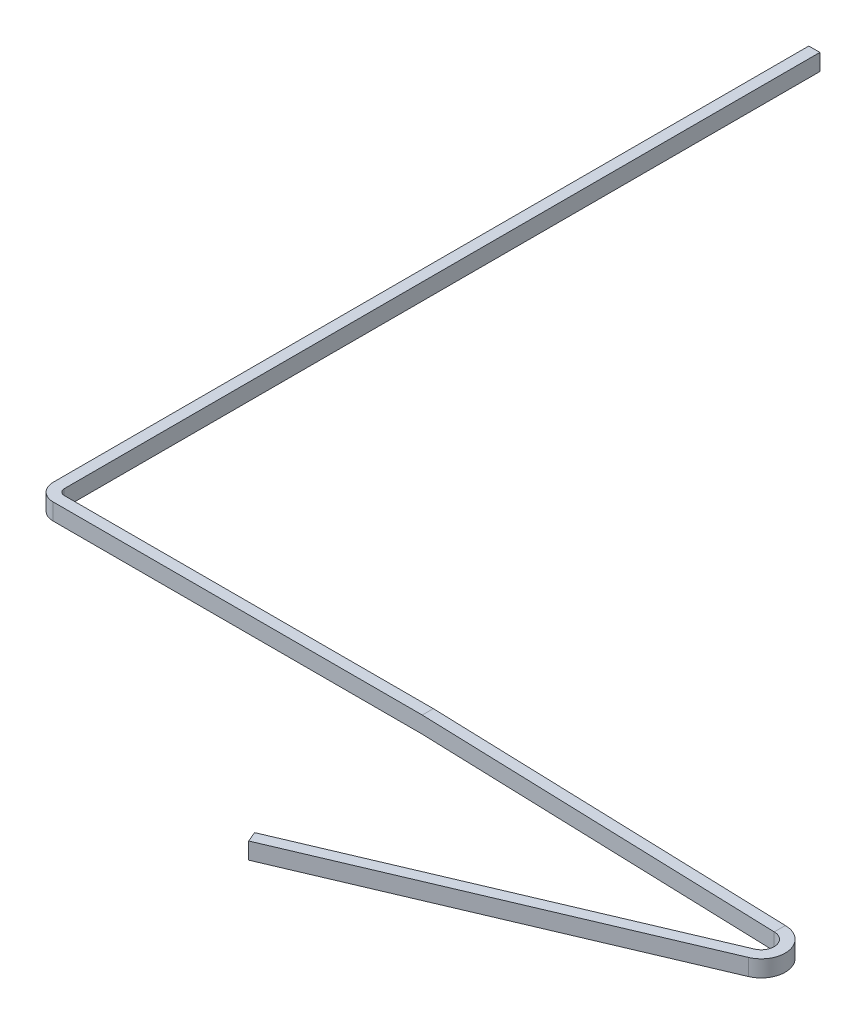
ISO-10303-21;
HEADER;
FILE_DESCRIPTION(('STEP AP214'),'2;1');
FILE_NAME('part.step','',(''),(''),'','','');
FILE_SCHEMA(('AUTOMOTIVE_DESIGN { 1 0 10303 214 1 1 1 1 }'));
ENDSEC;
DATA;
#1=APPLICATION_CONTEXT('core data for automotive mechanical design processes');
#2=APPLICATION_PROTOCOL_DEFINITION('international standard','automotive_design',2000,#1);
#3=PRODUCT_CONTEXT('',#1,'mechanical');
#4=PRODUCT('Part','Part','',(#3));
#5=PRODUCT_RELATED_PRODUCT_CATEGORY('part','',(#4));
#6=PRODUCT_DEFINITION_FORMATION('','',#4);
#7=PRODUCT_DEFINITION_CONTEXT('part definition',#1,'design');
#8=PRODUCT_DEFINITION('design','',#6,#7);
#9=PRODUCT_DEFINITION_SHAPE('','',#8);
#10=(LENGTH_UNIT() NAMED_UNIT(*) SI_UNIT(.MILLI.,.METRE.));
#11=(NAMED_UNIT(*) PLANE_ANGLE_UNIT() SI_UNIT($,.RADIAN.));
#12=(NAMED_UNIT(*) SI_UNIT($,.STERADIAN.) SOLID_ANGLE_UNIT());
#13=UNCERTAINTY_MEASURE_WITH_UNIT(LENGTH_MEASURE(1.E-05),#10,'distance_accuracy_value','');
#14=(GEOMETRIC_REPRESENTATION_CONTEXT(3) GLOBAL_UNCERTAINTY_ASSIGNED_CONTEXT((#13)) GLOBAL_UNIT_ASSIGNED_CONTEXT((#10,
#11,#12)) REPRESENTATION_CONTEXT('',''));
#15=CARTESIAN_POINT('',(0.,0.,0.));
#16=DIRECTION('',(0.,0.,1.));
#17=DIRECTION('',(1.,0.,0.));
#18=AXIS2_PLACEMENT_3D('',#15,#16,#17);
#19=CARTESIAN_POINT('',(0.31,0.225,20.94));
#20=DIRECTION('',(0.,0.,1.));
#21=DIRECTION('',(0.,-1.,0.));
#22=AXIS2_PLACEMENT_3D('',#19,#20,#21);
#23=PLANE('',#22);
#24=DIRECTION('',(1.,0.,0.));
#25=VECTOR('',#24,1.);
#26=CARTESIAN_POINT('',(5.08188626202887,0.225,20.94));
#27=LINE('',#26,#25);
#28=CARTESIAN_POINT('',(0.310000000000003,0.225,20.94));
#29=VERTEX_POINT('',#28);
#30=CARTESIAN_POINT('',(10.3137725240577,0.225,20.94));
#31=VERTEX_POINT('',#30);
#32=EDGE_CURVE('E129',#29,#31,#27,.T.);
#33=ORIENTED_EDGE('',*,*,#32,.F.);
#34=DIRECTION('',(0.,1.,0.));
#35=VECTOR('',#34,1.);
#36=CARTESIAN_POINT('',(0.31,0.,20.94));
#37=LINE('',#36,#35);
#38=CARTESIAN_POINT('',(0.310000000000003,-0.225,20.94));
#39=VERTEX_POINT('',#38);
#40=EDGE_CURVE('E339',#39,#29,#37,.T.);
#41=ORIENTED_EDGE('',*,*,#40,.F.);
#42=DIRECTION('',(-1.,0.,0.));
#43=VECTOR('',#42,1.);
#44=CARTESIAN_POINT('',(5.07811373797112,-0.225,20.94));
#45=LINE('',#44,#43);
#46=CARTESIAN_POINT('',(10.3062274759422,-0.225,20.94));
#47=VERTEX_POINT('',#46);
#48=EDGE_CURVE('E279',#47,#39,#45,.T.);
#49=ORIENTED_EDGE('',*,*,#48,.F.);
#50=DIRECTION('',(-0.999437908624531,0.0335241227211583,0.));
#51=VECTOR('',#50,1.);
#52=CARTESIAN_POINT('',(15.0762274759422,-0.385,20.94));
#53=LINE('',#52,#51);
#54=CARTESIAN_POINT('',(19.846227475959,-0.545,20.9399997962284));
#55=VERTEX_POINT('',#54);
#56=EDGE_CURVE('E147',#55,#47,#53,.T.);
#57=ORIENTED_EDGE('',*,*,#56,.F.);
#58=CARTESIAN_POINT('',(19.8537725521631,-0.095,20.9400161206263));
#59=CARTESIAN_POINT('',(19.85348221013,-0.113750037227534,20.9400136736476));
#60=CARTESIAN_POINT('',(19.8531895187394,-0.132500038202545,20.940011508159));
#61=CARTESIAN_POINT('',(19.8525991548161,-0.170000040152908,20.9400077317713));
#62=CARTESIAN_POINT('',(19.8523014822625,-0.188750041127931,20.9400061208746));
#63=CARTESIAN_POINT('',(19.8517008746749,-0.226250042070777,20.9400034452944));
#64=CARTESIAN_POINT('',(19.8513979396177,-0.245000042038225,20.9400023806134));
#65=CARTESIAN_POINT('',(19.8507869112439,-0.282500046184081,20.9400008368559));
#66=CARTESIAN_POINT('',(19.8504788179031,-0.301250050362094,20.9400003577822));
#67=CARTESIAN_POINT('',(19.849856034595,-0.3387500645657,20.9399998335579));
#68=CARTESIAN_POINT('',(19.8495413445873,-0.357500074590625,20.9399997884098));
#69=CARTESIAN_POINT('',(19.8489020268167,-0.395000080859868,20.9399996235497));
#70=CARTESIAN_POINT('',(19.8485773989715,-0.413750077102782,20.9399995038369));
#71=CARTESIAN_POINT('',(19.8479197916809,-0.451250072540748,20.9399993083345));
#72=CARTESIAN_POINT('',(19.8475868121691,-0.470000071734629,20.9399992325452));
#73=CARTESIAN_POINT('',(19.846912954389,-0.507500070123445,20.9399990993957));
#74=CARTESIAN_POINT('',(19.8465720760611,-0.526250069317308,20.9399990420355));
#75=CARTESIAN_POINT('',(19.8462274760261,-0.544999999998665,20.9399989811422));
#76=B_SPLINE_CURVE_WITH_KNOTS('',3,(#58,#59,#60,#61,#62,#63,#64,#65,#66,#67,#68,#69,#70,#71,#72,
#73,#74,#75),.UNSPECIFIED.,.F.,.F.,(4,2,2,2,2,2,2,2,4),(0.,0.0562568556126231,0.112513946321735,
0.168771286660986,0.225028891705291,0.281286841584522,0.337545257888005,0.393804123197101,
0.450063414156129),.UNSPECIFIED.);
#77=CARTESIAN_POINT('',(19.8537725311468,-0.0950000000000237,20.940008888062));
#78=VERTEX_POINT('',#77);
#79=EDGE_CURVE('E119',#55,#78,#76,.F.);
#80=ORIENTED_EDGE('',*,*,#79,.T.);
#81=DIRECTION('',(0.999437908624531,-0.0335241227211583,0.));
#82=VECTOR('',#81,1.);
#83=CARTESIAN_POINT('',(15.0837725240577,0.065,20.94));
#84=LINE('',#83,#82);
#85=EDGE_CURVE('E148',#31,#78,#84,.T.);
#86=ORIENTED_EDGE('',*,*,#85,.F.);
#87=EDGE_LOOP('',(#33,#41,#49,#57,#80,#86));
#88=FACE_BOUND('',#87,.T.);
#89=ADVANCED_FACE('F15',(#88),#23,.T.);
#90=CARTESIAN_POINT('',(0.310000000000006,-0.27,20.48));
#91=DIRECTION('',(0.,1.,0.));
#92=DIRECTION('',(0.,0.,1.));
#93=AXIS2_PLACEMENT_3D('',#90,#91,#92);
#94=CYLINDRICAL_SURFACE('',#93,0.460000000000002);
#95=CARTESIAN_POINT('',(0.310000000000006,0.225,20.48));
#96=DIRECTION('',(0.,1.,0.));
#97=DIRECTION('',(0.,0.,1.));
#98=AXIS2_PLACEMENT_3D('',#95,#96,#97);
#99=CIRCLE('',#98,0.460000000000002);
#100=CARTESIAN_POINT('',(-0.15,0.225,20.48));
#101=VERTEX_POINT('',#100);
#102=EDGE_CURVE('E19',#101,#29,#99,.T.);
#103=ORIENTED_EDGE('',*,*,#102,.F.);
#104=DIRECTION('',(0.,1.,0.));
#105=VECTOR('',#104,1.);
#106=CARTESIAN_POINT('',(-0.15,0.,20.48));
#107=LINE('',#106,#105);
#108=CARTESIAN_POINT('',(-0.15,-0.225,20.48));
#109=VERTEX_POINT('',#108);
#110=EDGE_CURVE('E96',#109,#101,#107,.T.);
#111=ORIENTED_EDGE('',*,*,#110,.F.);
#112=CARTESIAN_POINT('',(0.310000000000006,-0.225,20.48));
#113=DIRECTION('',(0.,1.,0.));
#114=DIRECTION('',(0.,0.,1.));
#115=AXIS2_PLACEMENT_3D('',#112,#113,#114);
#116=CIRCLE('',#115,0.460000000000002);
#117=EDGE_CURVE('E276',#39,#109,#116,.F.);
#118=ORIENTED_EDGE('',*,*,#117,.F.);
#119=ORIENTED_EDGE('',*,*,#40,.T.);
#120=EDGE_LOOP('',(#103,#111,#118,#119));
#121=FACE_BOUND('',#120,.T.);
#122=ADVANCED_FACE('F364',(#121),#94,.T.);
#123=CARTESIAN_POINT('',(-0.15,0.225,0.));
#124=DIRECTION('',(-1.,0.,0.));
#125=DIRECTION('',(0.,-1.,0.));
#126=AXIS2_PLACEMENT_3D('',#123,#124,#125);
#127=PLANE('',#126);
#128=DIRECTION('',(0.,0.,1.));
#129=VECTOR('',#128,1.);
#130=CARTESIAN_POINT('',(-0.15,0.225,10.47));
#131=LINE('',#130,#129);
#132=CARTESIAN_POINT('',(-0.15,0.225,0.));
#133=VERTEX_POINT('',#132);
#134=EDGE_CURVE('E311',#133,#101,#131,.T.);
#135=ORIENTED_EDGE('',*,*,#134,.F.);
#136=DIRECTION('',(0.,1.,0.));
#137=VECTOR('',#136,1.);
#138=CARTESIAN_POINT('',(-0.15,0.,0.));
#139=LINE('',#138,#137);
#140=CARTESIAN_POINT('',(-0.15,-0.225,0.));
#141=VERTEX_POINT('',#140);
#142=EDGE_CURVE('E108',#141,#133,#139,.T.);
#143=ORIENTED_EDGE('',*,*,#142,.F.);
#144=DIRECTION('',(0.,0.,-1.));
#145=VECTOR('',#144,1.);
#146=CARTESIAN_POINT('',(-0.15,-0.225,10.47));
#147=LINE('',#146,#145);
#148=EDGE_CURVE('E278',#109,#141,#147,.T.);
#149=ORIENTED_EDGE('',*,*,#148,.F.);
#150=ORIENTED_EDGE('',*,*,#110,.T.);
#151=EDGE_LOOP('',(#135,#143,#149,#150));
#152=FACE_BOUND('',#151,.T.);
#153=ADVANCED_FACE('F367',(#152),#127,.T.);
#154=CARTESIAN_POINT('',(0.15,-0.225,0.));
#155=DIRECTION('',(0.,0.,-1.));
#156=DIRECTION('',(-1.,0.,0.));
#157=AXIS2_PLACEMENT_3D('',#154,#155,#156);
#158=PLANE('',#157);
#159=ORIENTED_EDGE('',*,*,#142,.T.);
#160=DIRECTION('',(-1.,0.,0.));
#161=VECTOR('',#160,1.);
#162=CARTESIAN_POINT('',(5.08188626202887,0.225,0.));
#163=LINE('',#162,#161);
#164=CARTESIAN_POINT('',(0.149999999999966,0.225,0.));
#165=VERTEX_POINT('',#164);
#166=EDGE_CURVE('E314',#165,#133,#163,.T.);
#167=ORIENTED_EDGE('',*,*,#166,.F.);
#168=DIRECTION('',(0.,1.,0.));
#169=VECTOR('',#168,1.);
#170=CARTESIAN_POINT('',(0.15,0.,0.));
#171=LINE('',#170,#169);
#172=CARTESIAN_POINT('',(0.149999999999967,-0.225,0.));
#173=VERTEX_POINT('',#172);
#174=EDGE_CURVE('E323',#173,#165,#171,.T.);
#175=ORIENTED_EDGE('',*,*,#174,.F.);
#176=DIRECTION('',(1.,0.,0.));
#177=VECTOR('',#176,1.);
#178=CARTESIAN_POINT('',(5.07811373797112,-0.225,0.));
#179=LINE('',#178,#177);
#180=EDGE_CURVE('E284',#141,#173,#179,.T.);
#181=ORIENTED_EDGE('',*,*,#180,.F.);
#182=EDGE_LOOP('',(#159,#167,#175,#181));
#183=FACE_BOUND('',#182,.T.);
#184=ADVANCED_FACE('F371',(#183),#158,.T.);
#185=CARTESIAN_POINT('',(0.15,-0.225,0.));
#186=DIRECTION('',(1.,0.,0.));
#187=DIRECTION('',(0.,1.,0.));
#188=AXIS2_PLACEMENT_3D('',#185,#186,#187);
#189=PLANE('',#188);
#190=ORIENTED_EDGE('',*,*,#174,.T.);
#191=DIRECTION('',(0.,0.,-1.));
#192=VECTOR('',#191,1.);
#193=CARTESIAN_POINT('',(0.149999999999949,0.225,10.47));
#194=LINE('',#193,#192);
#195=CARTESIAN_POINT('',(0.149999999999974,0.225,20.48));
#196=VERTEX_POINT('',#195);
#197=EDGE_CURVE('E317',#196,#165,#194,.T.);
#198=ORIENTED_EDGE('',*,*,#197,.F.);
#199=DIRECTION('',(0.,-1.,0.));
#200=VECTOR('',#199,1.);
#201=CARTESIAN_POINT('',(0.15,0.,20.48));
#202=LINE('',#201,#200);
#203=CARTESIAN_POINT('',(0.149999999999975,-0.225,20.48));
#204=VERTEX_POINT('',#203);
#205=EDGE_CURVE('E326',#196,#204,#202,.T.);
#206=ORIENTED_EDGE('',*,*,#205,.T.);
#207=DIRECTION('',(0.,0.,1.));
#208=VECTOR('',#207,1.);
#209=CARTESIAN_POINT('',(0.149999999999951,-0.225,10.47));
#210=LINE('',#209,#208);
#211=EDGE_CURVE('E275',#173,#204,#210,.T.);
#212=ORIENTED_EDGE('',*,*,#211,.F.);
#213=EDGE_LOOP('',(#190,#198,#206,#212));
#214=FACE_BOUND('',#213,.T.);
#215=ADVANCED_FACE('F374',(#214),#189,.T.);
#216=CARTESIAN_POINT('',(-0.15,0.225,0.));
#217=DIRECTION('',(0.,1.,0.));
#218=DIRECTION('',(0.,0.,1.));
#219=AXIS2_PLACEMENT_3D('',#216,#217,#218);
#220=PLANE('',#219);
#221=ORIENTED_EDGE('',*,*,#134,.T.);
#222=ORIENTED_EDGE('',*,*,#102,.T.);
#223=ORIENTED_EDGE('',*,*,#32,.T.);
#224=DIRECTION('',(0.,0.,1.));
#225=VECTOR('',#224,1.);
#226=CARTESIAN_POINT('',(10.3137725240577,0.225,20.79));
#227=LINE('',#226,#225);
#228=CARTESIAN_POINT('',(10.3137725240577,0.225,20.64));
#229=VERTEX_POINT('',#228);
#230=EDGE_CURVE('E303',#229,#31,#227,.T.);
#231=ORIENTED_EDGE('',*,*,#230,.F.);
#232=DIRECTION('',(1.,0.,0.));
#233=VECTOR('',#232,1.);
#234=CARTESIAN_POINT('',(10.1405175796011,0.225,20.64));
#235=LINE('',#234,#233);
#236=CARTESIAN_POINT('',(0.309999999999999,0.225,20.64));
#237=VERTEX_POINT('',#236);
#238=EDGE_CURVE('E267',#237,#229,#235,.T.);
#239=ORIENTED_EDGE('',*,*,#238,.F.);
#240=CARTESIAN_POINT('',(0.31,0.225,20.48));
#241=DIRECTION('',(0.,1.,0.));
#242=DIRECTION('',(0.,0.,1.));
#243=AXIS2_PLACEMENT_3D('',#240,#241,#242);
#244=CIRCLE('',#243,0.160000000000002);
#245=EDGE_CURVE('E270',#196,#237,#244,.T.);
#246=ORIENTED_EDGE('',*,*,#245,.F.);
#247=ORIENTED_EDGE('',*,*,#197,.T.);
#248=ORIENTED_EDGE('',*,*,#166,.T.);
#249=EDGE_LOOP('',(#221,#222,#223,#231,#239,#246,#247,#248));
#250=FACE_BOUND('',#249,.T.);
#251=ADVANCED_FACE('F377',(#250),#220,.T.);
#252=CARTESIAN_POINT('',(19.8537725240577,-0.095,20.64));
#253=DIRECTION('',(0.0335241227211583,0.999437908624531,0.));
#254=DIRECTION('',(-0.999437908624531,0.0335241227211583,0.));
#255=AXIS2_PLACEMENT_3D('',#252,#253,#254);
#256=PLANE('',#255);
#257=ORIENTED_EDGE('',*,*,#230,.T.);
#258=ORIENTED_EDGE('',*,*,#85,.T.);
#259=DIRECTION('',(0.,0.,-1.));
#260=VECTOR('',#259,1.);
#261=CARTESIAN_POINT('',(19.8537725240577,-0.095,20.79));
#262=LINE('',#261,#260);
#263=CARTESIAN_POINT('',(19.8537725073826,-0.0949999999999996,20.640007210184));
#264=VERTEX_POINT('',#263);
#265=EDGE_CURVE('E301',#78,#264,#262,.T.);
#266=ORIENTED_EDGE('',*,*,#265,.T.);
#267=DIRECTION('',(0.999437908624531,-0.033524122721158,0.));
#268=VECTOR('',#267,1.);
#269=CARTESIAN_POINT('',(10.3137725240577,0.225,20.64));
#270=LINE('',#269,#268);
#271=EDGE_CURVE('E160',#229,#264,#270,.T.);
#272=ORIENTED_EDGE('',*,*,#271,.F.);
#273=EDGE_LOOP('',(#257,#258,#266,#272));
#274=FACE_BOUND('',#273,.T.);
#275=ADVANCED_FACE('F381',(#274),#256,.T.);
#276=CARTESIAN_POINT('',(10.3062274759422,-0.225,20.64));
#277=DIRECTION('',(-0.0335241227211583,-0.999437908624531,0.));
#278=DIRECTION('',(0.999437908624531,-0.0335241227211583,0.));
#279=AXIS2_PLACEMENT_3D('',#276,#277,#278);
#280=PLANE('',#279);
#281=ORIENTED_EDGE('',*,*,#56,.T.);
#282=DIRECTION('',(0.,0.,1.));
#283=VECTOR('',#282,1.);
#284=CARTESIAN_POINT('',(10.3062274759422,-0.225,10.47));
#285=LINE('',#284,#283);
#286=CARTESIAN_POINT('',(10.3062274759422,-0.225,20.64));
#287=VERTEX_POINT('',#286);
#288=EDGE_CURVE('E155',#287,#47,#285,.T.);
#289=ORIENTED_EDGE('',*,*,#288,.F.);
#290=DIRECTION('',(-0.999437908624531,0.033524122721158,0.));
#291=VECTOR('',#290,1.);
#292=CARTESIAN_POINT('',(19.8462274759423,-0.545,20.64));
#293=LINE('',#292,#291);
#294=CARTESIAN_POINT('',(19.8462274760559,-0.544999999885939,20.6399996705661));
#295=VERTEX_POINT('',#294);
#296=EDGE_CURVE('E151',#295,#287,#293,.T.);
#297=ORIENTED_EDGE('',*,*,#296,.F.);
#298=DIRECTION('',(0.,0.,1.));
#299=VECTOR('',#298,1.);
#300=CARTESIAN_POINT('',(19.8462274759422,-0.545,20.79));
#301=LINE('',#300,#299);
#302=EDGE_CURVE('E138',#295,#55,#301,.T.);
#303=ORIENTED_EDGE('',*,*,#302,.T.);
#304=EDGE_LOOP('',(#281,#289,#297,#303));
#305=FACE_BOUND('',#304,.T.);
#306=ADVANCED_FACE('F153',(#305),#280,.T.);
#307=CARTESIAN_POINT('',(-0.15,-0.225,20.94));
#308=DIRECTION('',(0.,-1.,0.));
#309=DIRECTION('',(0.,0.,-1.));
#310=AXIS2_PLACEMENT_3D('',#307,#308,#309);
#311=PLANE('',#310);
#312=ORIENTED_EDGE('',*,*,#211,.T.);
#313=CARTESIAN_POINT('',(0.31,-0.225,20.48));
#314=DIRECTION('',(0.,1.,0.));
#315=DIRECTION('',(0.,0.,1.));
#316=AXIS2_PLACEMENT_3D('',#313,#314,#315);
#317=CIRCLE('',#316,0.160000000000002);
#318=CARTESIAN_POINT('',(0.31,-0.225,20.64));
#319=VERTEX_POINT('',#318);
#320=EDGE_CURVE('E273',#319,#204,#317,.F.);
#321=ORIENTED_EDGE('',*,*,#320,.F.);
#322=DIRECTION('',(-1.,0.,0.));
#323=VECTOR('',#322,1.);
#324=CARTESIAN_POINT('',(10.1405175796011,-0.225000000000001,20.64));
#325=LINE('',#324,#323);
#326=EDGE_CURVE('E159',#287,#319,#325,.T.);
#327=ORIENTED_EDGE('',*,*,#326,.F.);
#328=ORIENTED_EDGE('',*,*,#288,.T.);
#329=ORIENTED_EDGE('',*,*,#48,.T.);
#330=ORIENTED_EDGE('',*,*,#117,.T.);
#331=ORIENTED_EDGE('',*,*,#148,.T.);
#332=ORIENTED_EDGE('',*,*,#180,.T.);
#333=EDGE_LOOP('',(#312,#321,#327,#328,#329,#330,#331,#332));
#334=FACE_BOUND('',#333,.T.);
#335=ADVANCED_FACE('F387',(#334),#311,.T.);
#336=CARTESIAN_POINT('',(0.31,-0.27,20.48));
#337=DIRECTION('',(0.,1.,0.));
#338=DIRECTION('',(0.,0.,1.));
#339=AXIS2_PLACEMENT_3D('',#336,#337,#338);
#340=CYLINDRICAL_SURFACE('',#339,0.160000000000002);
#341=ORIENTED_EDGE('',*,*,#205,.F.);
#342=ORIENTED_EDGE('',*,*,#245,.T.);
#343=DIRECTION('',(0.,1.,0.));
#344=VECTOR('',#343,1.);
#345=CARTESIAN_POINT('',(0.31,-0.16231,20.64));
#346=LINE('',#345,#344);
#347=EDGE_CURVE('E262',#319,#237,#346,.T.);
#348=ORIENTED_EDGE('',*,*,#347,.F.);
#349=ORIENTED_EDGE('',*,*,#320,.T.);
#350=EDGE_LOOP('',(#341,#342,#348,#349));
#351=FACE_BOUND('',#350,.T.);
#352=ADVANCED_FACE('F389',(#351),#340,.F.);
#353=CARTESIAN_POINT('',(0.31,-0.54962,20.64));
#354=DIRECTION('',(0.,0.,-1.));
#355=DIRECTION('',(0.,1.,0.));
#356=AXIS2_PLACEMENT_3D('',#353,#354,#355);
#357=PLANE('',#356);
#358=ORIENTED_EDGE('',*,*,#326,.T.);
#359=ORIENTED_EDGE('',*,*,#347,.T.);
#360=ORIENTED_EDGE('',*,*,#238,.T.);
#361=ORIENTED_EDGE('',*,*,#271,.T.);
#362=CARTESIAN_POINT('',(19.846227476502,-0.544999999938075,20.6399983528303));
#363=CARTESIAN_POINT('',(19.846524154453,-0.52624996438355,20.6399984486861));
#364=CARTESIAN_POINT('',(19.8468230329525,-0.507499963599196,20.6399985478439));
#365=CARTESIAN_POINT('',(19.8474254135995,-0.469999962030185,20.6399987661963));
#366=CARTESIAN_POINT('',(19.8477289157653,-0.451249961245822,20.639998885391));
#367=CARTESIAN_POINT('',(19.8483407652525,-0.413749958804545,20.6399991572498));
#368=CARTESIAN_POINT('',(19.8486491125945,-0.394999957147968,20.6399993099142));
#369=CARTESIAN_POINT('',(19.8492711710622,-0.357499957111335,20.6399995885954));
#370=CARTESIAN_POINT('',(19.8495848822126,-0.338749958731685,20.6399997146121));
#371=CARTESIAN_POINT('',(19.8502169981435,-0.301249965848583,20.6400001740817));
#372=CARTESIAN_POINT('',(19.850535402943,-0.28249997134545,20.6400005075354));
#373=CARTESIAN_POINT('',(19.8511749223636,-0.244999975679235,20.6400018472633));
#374=CARTESIAN_POINT('',(19.8514960369923,-0.226249974516284,20.6400028535395));
#375=CARTESIAN_POINT('',(19.8521413610317,-0.188749973813829,20.6400054216191));
#376=CARTESIAN_POINT('',(19.8524655704509,-0.169999974274472,20.6400069834241));
#377=CARTESIAN_POINT('',(19.8531168955032,-0.132499975195625,20.6400106864109));
#378=CARTESIAN_POINT('',(19.8534440111442,-0.113749975656271,20.6400128275942));
#379=CARTESIAN_POINT('',(19.8537724851736,-0.095,20.6400152703875));
#380=B_SPLINE_CURVE_WITH_KNOTS('',3,(#362,#363,#364,#365,#366,#367,#368,#369,#370,#371,#372,
#373,#374,#375,#376,#377,#378,#379),.UNSPECIFIED.,.F.,.F.,(4,2,2,2,2,2,2,2,4),(0.,
0.0562571475719195,0.112514517959333,0.16877212794887,0.225029994963634,0.281288088083937,
0.337546340013942,0.393804746883656,0.450063305319494),.UNSPECIFIED.);
#381=EDGE_CURVE('E164',#295,#264,#380,.T.);
#382=ORIENTED_EDGE('',*,*,#381,.F.);
#383=ORIENTED_EDGE('',*,*,#296,.T.);
#384=EDGE_LOOP('',(#358,#359,#360,#361,#382,#383));
#385=FACE_BOUND('',#384,.T.);
#386=ADVANCED_FACE('F166',(#385),#357,.T.);
#387=CARTESIAN_POINT('',(10.4211610505575,-0.095,20.6082717011431));
#388=DIRECTION('',(0.,1.,0.));
#389=DIRECTION('',(0.,0.,1.));
#390=AXIS2_PLACEMENT_3D('',#387,#388,#389);
#391=PLANE('',#390);
#392=ORIENTED_EDGE('',*,*,#265,.F.);
#393=CARTESIAN_POINT('',(19.8537724702601,-0.095,20.9400161199368));
#394=CARTESIAN_POINT('',(19.8733595037411,-0.095,20.9402337400033));
#395=CARTESIAN_POINT('',(19.8928801953588,-0.095,20.9420901581427));
#396=CARTESIAN_POINT('',(19.931342644882,-0.0950000000000001,20.9490204238001));
#397=CARTESIAN_POINT('',(19.9502843631324,-0.0950000000000001,20.9540944911856));
#398=CARTESIAN_POINT('',(20.0054214194851,-0.0950000000000001,20.9739997651512));
#399=CARTESIAN_POINT('',(20.0400910534083,-0.095,20.9935168249145));
#400=CARTESIAN_POINT('',(20.0857019043117,-0.095,21.0305271798003));
#401=CARTESIAN_POINT('',(20.0998953250249,-0.095,21.0442426259203));
#402=CARTESIAN_POINT('',(20.1257999142882,-0.095,21.0738600924684));
#403=CARTESIAN_POINT('',(20.1375090137298,-0.095,21.0897639174939));
#404=CARTESIAN_POINT('',(20.168400891354,-0.095,21.1399728954566));
#405=CARTESIAN_POINT('',(20.1835354553255,-0.095,21.1769321065531));
#406=CARTESIAN_POINT('',(20.2003716746371,-0.095,21.2538443907885));
#407=CARTESIAN_POINT('',(20.2020210864479,-0.095,21.2938085029345));
#408=CARTESIAN_POINT('',(20.192305801667,-0.095,21.3719577716123));
#409=CARTESIAN_POINT('',(20.181017555604,-0.095,21.4101520051165));
#410=CARTESIAN_POINT('',(20.1549380556283,-0.095,21.4629458729777));
#411=CARTESIAN_POINT('',(20.1446426635533,-0.095,21.4798701928655));
#412=CARTESIAN_POINT('',(20.1213311488646,-0.095,21.5117687675205));
#413=CARTESIAN_POINT('',(20.1083117419222,-0.095,21.5267406325247));
#414=CARTESIAN_POINT('',(20.0786558081357,-0.095,21.5556094290068));
#415=CARTESIAN_POINT('',(20.0617955932357,-0.095,21.5692772200238));
#416=CARTESIAN_POINT('',(20.0258678199351,-0.095,21.593302424267));
#417=CARTESIAN_POINT('',(20.0068004478196,-0.095,21.60366011659));
#418=CARTESIAN_POINT('',(19.9868982813718,-0.095,21.6121162221271));
#419=B_SPLINE_CURVE_WITH_KNOTS('',3,(#393,#394,#395,#396,#397,#398,#399,#400,#401,#402,#403,
#404,#405,#406,#407,#408,#409,#410,#411,#412,#413,#414,#415,#416,#417,#418),.UNSPECIFIED.,.F.,
.F.,(4,2,2,2,2,2,2,2,2,2,2,2,4),(0.,0.0586006613133755,0.117205327340391,0.233949950563391,
0.292923232264125,0.351945439696972,0.469290787439727,0.587090534506967,0.704197758677809,
0.763369062211479,0.822612123653744,0.887359876235325,0.952102168051754),.UNSPECIFIED.);
#420=CARTESIAN_POINT('',(19.9868982813718,-0.095,21.6121162221271));
#421=VERTEX_POINT('',#420);
#422=EDGE_CURVE('E173',#78,#421,#419,.T.);
#423=ORIENTED_EDGE('',*,*,#422,.T.);
#424=DIRECTION('',(0.920332063220277,0.,-0.391137946776719));
#425=VECTOR('',#424,1.);
#426=CARTESIAN_POINT('',(15.2341137946777,-0.095,23.632033206322));
#427=LINE('',#426,#425);
#428=CARTESIAN_POINT('',(10.4813293079835,-0.095,25.651950190517));
#429=VERTEX_POINT('',#428);
#430=EDGE_CURVE('E183',#429,#421,#427,.T.);
#431=ORIENTED_EDGE('',*,*,#430,.F.);
#432=DIRECTION('',(0.391137946776795,0.,0.920332063220245));
#433=VECTOR('',#432,1.);
#434=CARTESIAN_POINT('',(10.4813293079835,-0.095,25.6519501905169));
#435=LINE('',#434,#433);
#436=CARTESIAN_POINT('',(10.5986706920165,-0.095,25.928049809483));
#437=VERTEX_POINT('',#436);
#438=EDGE_CURVE('E260',#429,#437,#435,.T.);
#439=ORIENTED_EDGE('',*,*,#438,.T.);
#440=DIRECTION('',(-0.920332063220278,0.,0.391137946776717));
#441=VECTOR('',#440,1.);
#442=CARTESIAN_POINT('',(15.3514551787107,-0.095,23.9081328252881));
#443=LINE('',#442,#441);
#444=CARTESIAN_POINT('',(20.1042396654049,-0.095,21.8882158410932));
#445=VERTEX_POINT('',#444);
#446=EDGE_CURVE('E574',#445,#437,#443,.T.);
#447=ORIENTED_EDGE('',*,*,#446,.F.);
#448=CARTESIAN_POINT('',(19.8537724476414,-0.0950000000000001,20.6400152701093));
#449=CARTESIAN_POINT('',(19.892114477973,-0.095,20.6402265624621));
#450=CARTESIAN_POINT('',(19.9303517499454,-0.095,20.6438520066785));
#451=CARTESIAN_POINT('',(20.0055893104911,-0.095,20.6577382948582));
#452=CARTESIAN_POINT('',(20.0425899893197,-0.095,20.6679970242309));
#453=CARTESIAN_POINT('',(20.1470657402896,-0.095,20.7072472693622));
#454=CARTESIAN_POINT('',(20.2115693452361,-0.0950000000000001,20.7447904426084));
#455=CARTESIAN_POINT('',(20.3236837815949,-0.0950000000000001,20.839045472707));
#456=CARTESIAN_POINT('',(20.3713810274419,-0.095,20.8956562559566));
#457=CARTESIAN_POINT('',(20.4460431314981,-0.095,21.0214398975823));
#458=CARTESIAN_POINT('',(20.4729695461321,-0.095,21.0906357579818));
#459=CARTESIAN_POINT('',(20.5016811711818,-0.095,21.2338943076181));
#460=CARTESIAN_POINT('',(20.503506796984,-0.095,21.3079489803046));
#461=CARTESIAN_POINT('',(20.4831203942617,-0.095,21.4527909248612));
#462=CARTESIAN_POINT('',(20.4609100930585,-0.095,21.5235784311424));
#463=CARTESIAN_POINT('',(20.4106960413719,-0.095,21.6208777393742));
#464=CARTESIAN_POINT('',(20.3910620598658,-0.095,21.6519054075632));
#465=CARTESIAN_POINT('',(20.3468868053656,-0.095,21.7102350773691));
#466=CARTESIAN_POINT('',(20.3223482743165,-0.095,21.7375391464221));
#467=CARTESIAN_POINT('',(20.2678025546586,-0.095,21.7889587933974));
#468=CARTESIAN_POINT('',(20.2375867169409,-0.095,21.8128533388963));
#469=CARTESIAN_POINT('',(20.1734639801622,-0.095,21.8549761334725));
#470=CARTESIAN_POINT('',(20.1395590649892,-0.095,21.8732074079693));
#471=CARTESIAN_POINT('',(20.1042396654049,-0.095,21.8882158410932));
#472=B_SPLINE_CURVE_WITH_KNOTS('',3,(#448,#449,#450,#451,#452,#453,#454,#455,#456,#457,#458,
#459,#460,#461,#462,#463,#464,#465,#466,#467,#468,#469,#470,#471),.UNSPECIFIED.,.F.,.F.,(4,2,2,
2,2,2,2,2,2,2,2,4),(0.,0.114711816395936,0.229387082424498,0.448612167948229,0.666693009668605,
0.885176523004418,1.10330820948391,1.32142422115696,1.43110308051432,1.54072079329445,
1.65569554586362,1.77060877083512),.UNSPECIFIED.);
#473=EDGE_CURVE('E172',#264,#445,#472,.T.);
#474=ORIENTED_EDGE('',*,*,#473,.F.);
#475=EDGE_LOOP('',(#392,#423,#431,#439,#447,#474));
#476=FACE_BOUND('',#475,.T.);
#477=ADVANCED_FACE('F247',(#476),#391,.T.);
#478=CARTESIAN_POINT('',(19.8378561657475,-0.545,20.6399978401106));
#479=CARTESIAN_POINT('',(19.8416143614409,-0.545,20.6399973044332));
#480=CARTESIAN_POINT('',(19.8455359730956,-0.545,20.6399974769261));
#481=CARTESIAN_POINT('',(19.8664365079251,-0.545,20.640009289936));
#482=CARTESIAN_POINT('',(19.8871458173897,-0.545,20.6407969043451));
#483=CARTESIAN_POINT('',(19.9241294709313,-0.545,20.6439742316277));
#484=CARTESIAN_POINT('',(19.9425478603345,-0.545,20.6463548072916));
#485=CARTESIAN_POINT('',(19.9973939468906,-0.545,20.6558454549112));
#486=CARTESIAN_POINT('',(20.0334127070212,-0.545,20.6653110538418));
#487=CARTESIAN_POINT('',(20.1382479797765,-0.545,20.7027018597208));
#488=CARTESIAN_POINT('',(20.2037377753225,-0.545,20.7396590001917));
#489=CARTESIAN_POINT('',(20.3761329730039,-0.545,20.8804800229327));
#490=CARTESIAN_POINT('',(20.4573040391959,-0.545,21.0148556686266));
#491=CARTESIAN_POINT('',(20.516540768236,-0.545,21.3056844952159));
#492=CARTESIAN_POINT('',(20.4943959758241,-0.545,21.4611035518389));
#493=CARTESIAN_POINT('',(20.3562885429455,-0.545,21.7238139121708));
#494=CARTESIAN_POINT('',(20.2410198903508,-0.545,21.8300847181181));
#495=CARTESIAN_POINT('',(20.1042396654049,-0.545,21.8882158410932));
#496=CARTESIAN_POINT('',(19.8378561657475,-0.095,20.6399978401106));
#497=CARTESIAN_POINT('',(19.8416143614409,-0.095,20.6399973044332));
#498=CARTESIAN_POINT('',(19.8455359730956,-0.095,20.6399974769261));
#499=CARTESIAN_POINT('',(19.8664365079251,-0.095,20.640009289936));
#500=CARTESIAN_POINT('',(19.8871458173897,-0.095,20.6407969043451));
#501=CARTESIAN_POINT('',(19.9241294709313,-0.095,20.6439742316277));
#502=CARTESIAN_POINT('',(19.9425478603345,-0.095,20.6463548072916));
#503=CARTESIAN_POINT('',(19.9973939468906,-0.095,20.6558454549112));
#504=CARTESIAN_POINT('',(20.0334127070212,-0.095,20.6653110538418));
#505=CARTESIAN_POINT('',(20.1382479797765,-0.095,20.7027018597208));
#506=CARTESIAN_POINT('',(20.2037377753225,-0.095,20.7396590001917));
#507=CARTESIAN_POINT('',(20.3761329730039,-0.095,20.8804800229327));
#508=CARTESIAN_POINT('',(20.4573040391959,-0.095,21.0148556686266));
#509=CARTESIAN_POINT('',(20.516540768236,-0.095,21.3056844952159));
#510=CARTESIAN_POINT('',(20.4943959758241,-0.095,21.4611035518389));
#511=CARTESIAN_POINT('',(20.3562885429455,-0.095,21.7238139121708));
#512=CARTESIAN_POINT('',(20.2410198903508,-0.095,21.8300847181181));
#513=CARTESIAN_POINT('',(20.1042396654049,-0.095,21.8882158410932));
#514=B_SPLINE_SURFACE_WITH_KNOTS('',1,3,((#478,#479,#480,#481,#482,#483,#484,#485,#486,#487,
#488,#489,#490,#491,#492,#493,#494,#495),(#496,#497,#498,#499,#500,#501,#502,#503,#504,#505,
#506,#507,#508,#509,#510,#511,#512,#513)),.UNSPECIFIED.,.F.,.F.,.F.,(2,2),(4,2,2,2,2,2,2,2,4),
(0.,1.),(-0.00099385361416,0.,0.00365936029408,0.00731872058815,0.0146374411763,
0.02927488235261,0.05854976470521,0.08782464705782,0.11709952941042),.UNSPECIFIED.);
#515=CARTESIAN_POINT('',(19.8500000000001,-0.545,20.64));
#516=CARTESIAN_POINT('',(19.888360659457,-0.545,20.6400043187599));
#517=CARTESIAN_POINT('',(19.9266209385164,-0.545,20.6434038848483));
#518=CARTESIAN_POINT('',(20.0019415597412,-0.545,20.6568465049287));
#519=CARTESIAN_POINT('',(20.039002308775,-0.545,20.6668872809852));
#520=CARTESIAN_POINT('',(20.1435320282847,-0.545,20.7055004010783));
#521=CARTESIAN_POINT('',(20.2081440251931,-0.545,20.7426203853232));
#522=CARTESIAN_POINT('',(20.2925656869375,-0.545,20.812563920111));
#523=CARTESIAN_POINT('',(20.3186383891132,-0.545,20.8382803707191));
#524=CARTESIAN_POINT('',(20.3661720771771,-0.545,20.8937547333407));
#525=CARTESIAN_POINT('',(20.3876291528473,-0.545,20.9235160374768));
#526=CARTESIAN_POINT('',(20.4253439325005,-0.545,20.9861354727811));
#527=CARTESIAN_POINT('',(20.4416047914565,-0.545,21.0189917090552));
#528=CARTESIAN_POINT('',(20.4684359321939,-0.545,21.0869629085808));
#529=CARTESIAN_POINT('',(20.4790028885499,-0.545,21.1220791783941));
#530=CARTESIAN_POINT('',(20.5012540661674,-0.545,21.2293255295456));
#531=CARTESIAN_POINT('',(20.5036128932808,-0.545,21.3035587484417));
#532=CARTESIAN_POINT('',(20.4841916893229,-0.545,21.4485985844088));
#533=CARTESIAN_POINT('',(20.4624709915608,-0.545,21.5194131773754));
#534=CARTESIAN_POINT('',(20.4129741328102,-0.545,21.6169868626305));
#535=CARTESIAN_POINT('',(20.3935562915537,-0.545,21.648165351903));
#536=CARTESIAN_POINT('',(20.3497359898799,-0.545,21.7068684213284));
#537=CARTESIAN_POINT('',(20.3253277505721,-0.545,21.7343887037465));
#538=CARTESIAN_POINT('',(20.2705486135103,-0.545,21.7866956558073));
#539=CARTESIAN_POINT('',(20.2398905989944,-0.545,21.8111822524828));
#540=CARTESIAN_POINT('',(20.1747234185566,-0.545,21.8542980704111));
#541=CARTESIAN_POINT('',(20.1402156647724,-0.545,21.8729294299361));
#542=CARTESIAN_POINT('',(20.1042396654049,-0.545,21.8882158410932));
#543=B_SPLINE_CURVE_WITH_KNOTS('',3,(#515,#516,#517,#518,#519,#520,#521,#522,#523,#524,#525,
#526,#527,#528,#529,#530,#531,#532,#533,#534,#535,#536,#537,#538,#539,#540,#541,#542),
.UNSPECIFIED.,.F.,.F.,(4,2,2,2,2,2,2,2,2,2,2,2,2,4),(0.,0.114735445989223,0.229431558106413,
0.447998711030761,0.55744676309801,0.666987174205372,0.776460949022807,0.885998590996382,
1.10439143493668,1.32224734030466,1.43195857758332,1.54179758766743,1.65888211010922,
1.77592382467108),.UNSPECIFIED.);
#544=CARTESIAN_POINT('',(19.8500000000001,-0.545,20.64));
#545=VERTEX_POINT('',#544);
#546=CARTESIAN_POINT('',(20.1042396654049,-0.545,21.8882158410932));
#547=VERTEX_POINT('',#546);
#548=EDGE_CURVE('E177',#545,#547,#543,.T.);
#549=DIRECTION('',(1.,0.,0.));
#550=VECTOR('',#549,1.);
#551=CARTESIAN_POINT('',(15.4913745961773,-0.545,20.64));
#552=LINE('',#551,#550);
#553=EDGE_CURVE('E144',#295,#545,#552,.T.);
#554=DIRECTION('',(0.,1.,0.));
#555=VECTOR('',#554,1.);
#556=CARTESIAN_POINT('',(20.1042396654049,-0.32,21.8882158410932));
#557=LINE('',#556,#555);
#558=EDGE_CURVE('E572',#547,#445,#557,.T.);
#559=ORIENTED_EDGE('',*,*,#548,.F.);
#560=ORIENTED_EDGE('',*,*,#553,.F.);
#561=ORIENTED_EDGE('',*,*,#381,.T.);
#562=ORIENTED_EDGE('',*,*,#473,.T.);
#563=ORIENTED_EDGE('',*,*,#558,.F.);
#564=EDGE_LOOP('',(#559,#560,#561,#562,#563));
#565=FACE_BOUND('',#564,.T.);
#566=ADVANCED_FACE('F176',(#565),#514,.T.);
#567=CARTESIAN_POINT('',(10.5986706920165,-0.545,25.928049809483));
#568=DIRECTION('',(0.391137946776717,0.,0.920332063220278));
#569=DIRECTION('',(0.920332063220278,0.,-0.391137946776717));
#570=AXIS2_PLACEMENT_3D('',#567,#568,#569);
#571=PLANE('',#570);
#572=ORIENTED_EDGE('',*,*,#558,.T.);
#573=ORIENTED_EDGE('',*,*,#446,.T.);
#574=DIRECTION('',(0.,-1.,0.));
#575=VECTOR('',#574,1.);
#576=CARTESIAN_POINT('',(10.5986706920165,-0.32,25.928049809483));
#577=LINE('',#576,#575);
#578=CARTESIAN_POINT('',(10.5986706920165,-0.545,25.928049809483));
#579=VERTEX_POINT('',#578);
#580=EDGE_CURVE('E240',#437,#579,#577,.T.);
#581=ORIENTED_EDGE('',*,*,#580,.T.);
#582=DIRECTION('',(-0.920332063220279,0.,0.391137946776714));
#583=VECTOR('',#582,1.);
#584=CARTESIAN_POINT('',(20.1042396654049,-0.545,21.8882158410932));
#585=LINE('',#584,#583);
#586=EDGE_CURVE('E180',#547,#579,#585,.T.);
#587=ORIENTED_EDGE('',*,*,#586,.F.);
#588=EDGE_LOOP('',(#572,#573,#581,#587));
#589=FACE_BOUND('',#588,.T.);
#590=ADVANCED_FACE('F253',(#589),#571,.T.);
#591=CARTESIAN_POINT('',(19.9868982813718,-0.545,21.6121162221271));
#592=DIRECTION('',(-0.391137946776719,0.,-0.920332063220277));
#593=DIRECTION('',(-0.920332063220277,0.,0.391137946776719));
#594=AXIS2_PLACEMENT_3D('',#591,#592,#593);
#595=PLANE('',#594);
#596=ORIENTED_EDGE('',*,*,#430,.T.);
#597=DIRECTION('',(0.,1.,0.));
#598=VECTOR('',#597,1.);
#599=CARTESIAN_POINT('',(19.9868982813718,-0.32,21.6121162221271));
#600=LINE('',#599,#598);
#601=CARTESIAN_POINT('',(19.9868982813718,-0.545,21.6121162221271));
#602=VERTEX_POINT('',#601);
#603=EDGE_CURVE('E178',#602,#421,#600,.T.);
#604=ORIENTED_EDGE('',*,*,#603,.F.);
#605=DIRECTION('',(0.920332063220277,0.,-0.391137946776719));
#606=VECTOR('',#605,1.);
#607=CARTESIAN_POINT('',(10.4813293079835,-0.545,25.651950190517));
#608=LINE('',#607,#606);
#609=CARTESIAN_POINT('',(10.4813293079835,-0.545,25.651950190517));
#610=VERTEX_POINT('',#609);
#611=EDGE_CURVE('E225',#610,#602,#608,.T.);
#612=ORIENTED_EDGE('',*,*,#611,.F.);
#613=DIRECTION('',(0.,1.,0.));
#614=VECTOR('',#613,1.);
#615=CARTESIAN_POINT('',(10.4813293079835,-0.32,25.651950190517));
#616=LINE('',#615,#614);
#617=EDGE_CURVE('E33',#610,#429,#616,.T.);
#618=ORIENTED_EDGE('',*,*,#617,.T.);
#619=EDGE_LOOP('',(#596,#604,#612,#618));
#620=FACE_BOUND('',#619,.T.);
#621=ADVANCED_FACE('F206',(#620),#595,.T.);
#622=CARTESIAN_POINT('',(19.8380028894965,-0.095,20.9399989034239));
#623=CARTESIAN_POINT('',(19.842313616917,-0.095,20.9399985417351));
#624=CARTESIAN_POINT('',(19.8464676811511,-0.095,20.9399985455617));
#625=CARTESIAN_POINT('',(19.8621487614918,-0.095,20.9400050022732));
#626=CARTESIAN_POINT('',(19.870001593979,-0.095,20.9404291023397));
#627=CARTESIAN_POINT('',(19.889915868963,-0.095,20.9421399708764));
#628=CARTESIAN_POINT('',(19.8998334632571,-0.095,20.9434218193108));
#629=CARTESIAN_POINT('',(19.9293659714026,-0.095,20.9485321680292));
#630=CARTESIAN_POINT('',(19.948760688396,-0.095,20.9536290289917));
#631=CARTESIAN_POINT('',(20.005210450649,-0.095,20.9737625398497));
#632=CARTESIAN_POINT('',(20.0404741867121,-0.095,20.9936625385647));
#633=CARTESIAN_POINT('',(20.133302370079,-0.095,21.0694892431176));
#634=CARTESIAN_POINT('',(20.1770098672595,-0.095,21.1418453600298));
#635=CARTESIAN_POINT('',(20.2089065675115,-0.095,21.2984454974239));
#636=CARTESIAN_POINT('',(20.1969824485208,-0.095,21.3821326817595));
#637=CARTESIAN_POINT('',(20.1226169077397,-0.095,21.5235921065534));
#638=CARTESIAN_POINT('',(20.0605491717274,-0.095,21.5808148482174));
#639=CARTESIAN_POINT('',(19.9868982813718,-0.095,21.6121162221271));
#640=CARTESIAN_POINT('',(19.8380028894965,-0.545,20.9399989034239));
#641=CARTESIAN_POINT('',(19.842313616917,-0.545,20.9399985417351));
#642=CARTESIAN_POINT('',(19.8464676811511,-0.545,20.9399985455617));
#643=CARTESIAN_POINT('',(19.8621487614918,-0.545,20.9400050022732));
#644=CARTESIAN_POINT('',(19.870001593979,-0.545,20.9404291023397));
#645=CARTESIAN_POINT('',(19.889915868963,-0.545,20.9421399708764));
#646=CARTESIAN_POINT('',(19.8998334632571,-0.545,20.9434218193108));
#647=CARTESIAN_POINT('',(19.9293659714026,-0.545,20.9485321680292));
#648=CARTESIAN_POINT('',(19.948760688396,-0.545,20.9536290289917));
#649=CARTESIAN_POINT('',(20.005210450649,-0.545,20.9737625398497));
#650=CARTESIAN_POINT('',(20.0404741867121,-0.545,20.9936625385647));
#651=CARTESIAN_POINT('',(20.133302370079,-0.545,21.0694892431176));
#652=CARTESIAN_POINT('',(20.1770098672595,-0.545,21.1418453600298));
#653=CARTESIAN_POINT('',(20.2089065675115,-0.545,21.2984454974239));
#654=CARTESIAN_POINT('',(20.1969824485208,-0.545,21.3821326817595));
#655=CARTESIAN_POINT('',(20.1226169077397,-0.545,21.5235921065534));
#656=CARTESIAN_POINT('',(20.0605491717274,-0.545,21.5808148482174));
#657=CARTESIAN_POINT('',(19.9868982813718,-0.545,21.6121162221271));
#658=B_SPLINE_SURFACE_WITH_KNOTS('',1,3,((#622,#623,#624,#625,#626,#627,#628,#629,#630,#631,
#632,#633,#634,#635,#636,#637,#638,#639),(#640,#641,#642,#643,#644,#645,#646,#647,#648,#649,
#650,#651,#652,#653,#654,#655,#656,#657)),.UNSPECIFIED.,.F.,.F.,.F.,(2,2),(4,2,2,2,2,2,2,2,4),
(0.,1.),(-0.00106397901962,0.,0.00365936029408,0.00731872058815,0.0146374411763,
0.02927488235261,0.05854976470521,0.08782464705782,0.11709952941042),.UNSPECIFIED.);
#659=DIRECTION('',(-1.,0.,0.));
#660=VECTOR('',#659,1.);
#661=CARTESIAN_POINT('',(15.4913745961773,-0.545,20.94));
#662=LINE('',#661,#660);
#663=CARTESIAN_POINT('',(19.85,-0.545,20.94));
#664=VERTEX_POINT('',#663);
#665=EDGE_CURVE('E25',#664,#55,#662,.T.);
#666=CARTESIAN_POINT('',(19.9868982813718,-0.545,21.6121162221271));
#667=CARTESIAN_POINT('',(20.0232168228053,-0.545,21.5967167026277));
#668=CARTESIAN_POINT('',(20.0567935222807,-0.545,21.5749093463834));
#669=CARTESIAN_POINT('',(20.1150871937299,-0.545,21.5216299486729));
#670=CARTESIAN_POINT('',(20.139809079499,-0.545,21.4901632854995));
#671=CARTESIAN_POINT('',(20.1770496477913,-0.545,21.4207206403005));
#672=CARTESIAN_POINT('',(20.1895783151175,-0.545,21.382750014269));
#673=CARTESIAN_POINT('',(20.201683578468,-0.545,21.3049572144614));
#674=CARTESIAN_POINT('',(20.2013107429841,-0.545,21.2651428803672));
#675=CARTESIAN_POINT('',(20.1870501990881,-0.545,21.187761849035));
#676=CARTESIAN_POINT('',(20.1730864788599,-0.545,21.1502090549941));
#677=CARTESIAN_POINT('',(20.1339141892115,-0.545,21.0819440356128));
#678=CARTESIAN_POINT('',(20.1087884775295,-0.545,21.0511838609029));
#679=CARTESIAN_POINT('',(20.0493423644815,-0.545,20.9995690520426));
#680=CARTESIAN_POINT('',(20.0149443224733,-0.544999999999999,20.9788023863394));
#681=CARTESIAN_POINT('',(19.9578545314174,-0.545,20.956309537812));
#682=CARTESIAN_POINT('',(19.9367640847148,-0.545,20.9502226907249));
#683=CARTESIAN_POINT('',(19.8937994275218,-0.545,20.9420615933634));
#684=CARTESIAN_POINT('',(19.8719244702846,-0.545,20.9399912753899));
#685=CARTESIAN_POINT('',(19.8499999999975,-0.544999999999999,20.94));
#686=B_SPLINE_CURVE_WITH_KNOTS('',3,(#666,#667,#668,#669,#670,#671,#672,#673,#674,#675,#676,
#677,#678,#679,#680,#681,#682,#683,#684,#685),.UNSPECIFIED.,.F.,.F.,(4,2,2,2,2,2,2,2,2,4),(0.,
0.117848498601437,0.235631497928576,0.35331796555979,0.470543203933834,0.588427855554583,
0.705451679315455,0.823487579408216,0.889004181516552,0.954584894011658),.UNSPECIFIED.);
#687=EDGE_CURVE('E220',#602,#664,#686,.T.);
#688=ORIENTED_EDGE('',*,*,#603,.T.);
#689=ORIENTED_EDGE('',*,*,#422,.F.);
#690=ORIENTED_EDGE('',*,*,#79,.F.);
#691=ORIENTED_EDGE('',*,*,#665,.F.);
#692=ORIENTED_EDGE('',*,*,#687,.F.);
#693=EDGE_LOOP('',(#688,#689,#690,#691,#692));
#694=FACE_BOUND('',#693,.T.);
#695=ADVANCED_FACE('F195',(#694),#658,.T.);
#696=CARTESIAN_POINT('',(10.4212087645252,-0.545,25.9597781083399));
#697=DIRECTION('',(0.,-1.,0.));
#698=DIRECTION('',(0.,0.,-1.));
#699=AXIS2_PLACEMENT_3D('',#696,#697,#698);
#700=PLANE('',#699);
#701=ORIENTED_EDGE('',*,*,#687,.T.);
#702=ORIENTED_EDGE('',*,*,#665,.T.);
#703=ORIENTED_EDGE('',*,*,#302,.F.);
#704=ORIENTED_EDGE('',*,*,#553,.T.);
#705=ORIENTED_EDGE('',*,*,#548,.T.);
#706=ORIENTED_EDGE('',*,*,#586,.T.);
#707=DIRECTION('',(0.391137946776738,0.,0.920332063220269));
#708=VECTOR('',#707,1.);
#709=CARTESIAN_POINT('',(10.54,-0.545,25.79));
#710=LINE('',#709,#708);
#711=EDGE_CURVE('E10',#610,#579,#710,.T.);
#712=ORIENTED_EDGE('',*,*,#711,.F.);
#713=ORIENTED_EDGE('',*,*,#611,.T.);
#714=EDGE_LOOP('',(#701,#702,#703,#704,#705,#706,#712,#713));
#715=FACE_BOUND('',#714,.T.);
#716=ADVANCED_FACE('F141',(#715),#700,.T.);
#717=CARTESIAN_POINT('',(10.4813293079835,-0.545,25.651950190517));
#718=DIRECTION('',(-0.920332063220269,0.,0.391137946776738));
#719=DIRECTION('',(0.391137946776738,0.,0.920332063220269));
#720=AXIS2_PLACEMENT_3D('',#717,#718,#719);
#721=PLANE('',#720);
#722=ORIENTED_EDGE('',*,*,#617,.F.);
#723=ORIENTED_EDGE('',*,*,#711,.T.);
#724=ORIENTED_EDGE('',*,*,#580,.F.);
#725=ORIENTED_EDGE('',*,*,#438,.F.);
#726=EDGE_LOOP('',(#722,#723,#724,#725));
#727=FACE_BOUND('',#726,.T.);
#728=ADVANCED_FACE('F17',(#727),#721,.T.);
#729=CLOSED_SHELL('',(#89,#122,#153,#184,#215,#251,#275,#306,#335,#352,#386,#477,#566,#590,#621,
#695,#716,#728));
#730=MANIFOLD_SOLID_BREP('B1',#729);
#731=ADVANCED_BREP_SHAPE_REPRESENTATION('',(#18,#730),#14);
#732=SHAPE_DEFINITION_REPRESENTATION(#9,#731);
ENDSEC;
END-ISO-10303-21;
